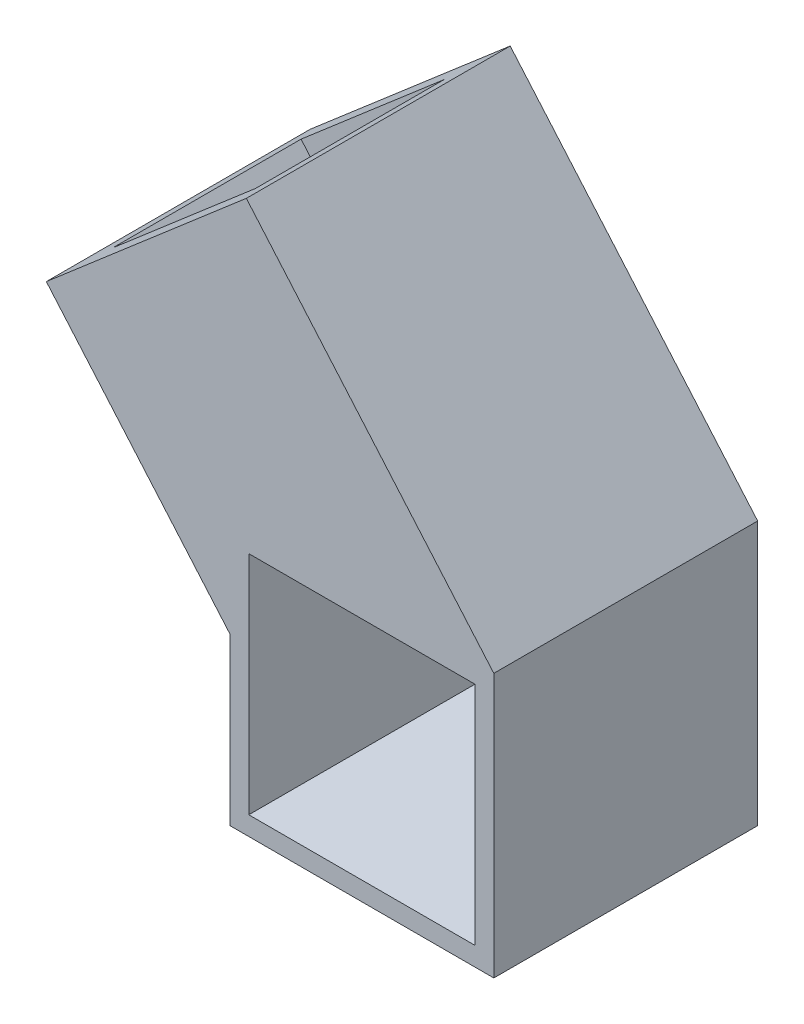
ISO-10303-21;
HEADER;
FILE_DESCRIPTION(('STEP AP214'),'2;1');
FILE_NAME('part.step','',(''),(''),'','','');
FILE_SCHEMA(('AUTOMOTIVE_DESIGN { 1 0 10303 214 1 1 1 1 }'));
ENDSEC;
DATA;
#1=APPLICATION_CONTEXT('core data for automotive mechanical design processes');
#2=APPLICATION_PROTOCOL_DEFINITION('international standard','automotive_design',2000,#1);
#3=PRODUCT_CONTEXT('',#1,'mechanical');
#4=PRODUCT('Part','Part','',(#3));
#5=PRODUCT_RELATED_PRODUCT_CATEGORY('part','',(#4));
#6=PRODUCT_DEFINITION_FORMATION('','',#4);
#7=PRODUCT_DEFINITION_CONTEXT('part definition',#1,'design');
#8=PRODUCT_DEFINITION('design','',#6,#7);
#9=PRODUCT_DEFINITION_SHAPE('','',#8);
#10=(LENGTH_UNIT() NAMED_UNIT(*) SI_UNIT(.MILLI.,.METRE.));
#11=(NAMED_UNIT(*) PLANE_ANGLE_UNIT() SI_UNIT($,.RADIAN.));
#12=(NAMED_UNIT(*) SI_UNIT($,.STERADIAN.) SOLID_ANGLE_UNIT());
#13=UNCERTAINTY_MEASURE_WITH_UNIT(LENGTH_MEASURE(1.E-05),#10,'distance_accuracy_value','');
#14=(GEOMETRIC_REPRESENTATION_CONTEXT(3) GLOBAL_UNCERTAINTY_ASSIGNED_CONTEXT((#13)) GLOBAL_UNIT_ASSIGNED_CONTEXT((#10,
#11,#12)) REPRESENTATION_CONTEXT('',''));
#15=CARTESIAN_POINT('',(0.,0.,0.));
#16=DIRECTION('',(0.,0.,1.));
#17=DIRECTION('',(1.,0.,0.));
#18=AXIS2_PLACEMENT_3D('',#15,#16,#17);
#19=CARTESIAN_POINT('',(-14.0963511863711,16.3822471357785,14.));
#20=DIRECTION('',(-0.652241888058342,0.75801089666448,0.));
#21=DIRECTION('',(-0.75801089666448,-0.652241888058342,0.));
#22=AXIS2_PLACEMENT_3D('',#19,#20,#21);
#23=PLANE('',#22);
#24=DIRECTION('',(0.75801089666448,0.652241888058342,0.));
#25=VECTOR('',#24,1.);
#26=CARTESIAN_POINT('',(-14.0963511863711,16.3822471357785,0.));
#27=LINE('',#26,#25);
#28=CARTESIAN_POINT('',(-9.74268618755543,20.1284237294086,0.));
#29=VERTEX_POINT('',#28);
#30=CARTESIAN_POINT('',(0.869466018358234,29.2598098633093,0.));
#31=VERTEX_POINT('',#30);
#32=EDGE_CURVE('E186',#29,#31,#27,.T.);
#33=ORIENTED_EDGE('',*,*,#32,.F.);
#34=DIRECTION('',(0.,0.,-1.));
#35=VECTOR('',#34,1.);
#36=CARTESIAN_POINT('',(-9.74268618755543,20.1284237294086,14.));
#37=LINE('',#36,#35);
#38=CARTESIAN_POINT('',(-9.74268618755543,20.1284237294086,14.));
#39=VERTEX_POINT('',#38);
#40=EDGE_CURVE('E216',#39,#29,#37,.T.);
#41=ORIENTED_EDGE('',*,*,#40,.F.);
#42=DIRECTION('',(0.75801089666448,0.652241888058342,0.));
#43=VECTOR('',#42,1.);
#44=CARTESIAN_POINT('',(-14.0963511863711,16.3822471357785,14.));
#45=LINE('',#44,#43);
#46=CARTESIAN_POINT('',(0.869466018358234,29.2598098633093,14.));
#47=VERTEX_POINT('',#46);
#48=EDGE_CURVE('E192',#39,#47,#45,.T.);
#49=ORIENTED_EDGE('',*,*,#48,.T.);
#50=DIRECTION('',(0.,0.,-1.));
#51=VECTOR('',#50,1.);
#52=CARTESIAN_POINT('',(0.869466018358234,29.2598098633093,14.));
#53=LINE('',#52,#51);
#54=EDGE_CURVE('E205',#47,#31,#53,.T.);
#55=ORIENTED_EDGE('',*,*,#54,.T.);
#56=EDGE_LOOP('',(#33,#41,#49,#55));
#57=FACE_BOUND('',#56,.T.);
#58=DIRECTION('',(-0.75801089666448,-0.652241888058342,0.));
#59=VECTOR('',#58,1.);
#60=CARTESIAN_POINT('',(-14.0963511863711,16.3822471357785,12.));
#61=LINE('',#60,#59);
#62=CARTESIAN_POINT('',(-0.646555427581676,27.9553263861087,12.));
#63=VERTEX_POINT('',#62);
#64=CARTESIAN_POINT('',(-8.22666439422648,21.4329075055253,12.));
#65=VERTEX_POINT('',#64);
#66=EDGE_CURVE('E177',#63,#65,#61,.T.);
#67=ORIENTED_EDGE('',*,*,#66,.T.);
#68=DIRECTION('',(0.,0.,-1.));
#69=VECTOR('',#68,1.);
#70=CARTESIAN_POINT('',(-8.22666439422648,21.4329075055253,0.));
#71=LINE('',#70,#69);
#72=CARTESIAN_POINT('',(-8.22666439422648,21.4329075055253,2.));
#73=VERTEX_POINT('',#72);
#74=EDGE_CURVE('E55',#65,#73,#71,.T.);
#75=ORIENTED_EDGE('',*,*,#74,.T.);
#76=DIRECTION('',(0.75801089666448,0.652241888058342,0.));
#77=VECTOR('',#76,1.);
#78=CARTESIAN_POINT('',(-14.0963511863711,16.3822471357785,2.));
#79=LINE('',#78,#77);
#80=CARTESIAN_POINT('',(-0.646555427581677,27.9553263861087,2.));
#81=VERTEX_POINT('',#80);
#82=EDGE_CURVE('E164',#73,#81,#79,.T.);
#83=ORIENTED_EDGE('',*,*,#82,.T.);
#84=DIRECTION('',(0.,0.,1.));
#85=VECTOR('',#84,1.);
#86=CARTESIAN_POINT('',(-0.646555427581677,27.9553263861087,0.));
#87=LINE('',#86,#85);
#88=EDGE_CURVE('E168',#81,#63,#87,.T.);
#89=ORIENTED_EDGE('',*,*,#88,.T.);
#90=EDGE_LOOP('',(#67,#75,#83,#89));
#91=FACE_BOUND('',#90,.T.);
#92=ADVANCED_FACE('F39',(#57,#91),#23,.T.);
#93=CARTESIAN_POINT('',(0.,0.,14.));
#94=DIRECTION('',(0.,0.,-1.));
#95=DIRECTION('',(-1.,0.,0.));
#96=AXIS2_PLACEMENT_3D('',#93,#94,#95);
#97=PLANE('',#96);
#98=DIRECTION('',(-0.652241888058342,0.75801089666448,0.));
#99=VECTOR('',#98,1.);
#100=CARTESIAN_POINT('',(4.35366499881566,3.74617659363011,14.));
#101=LINE('',#100,#99);
#102=CARTESIAN_POINT('',(0.,8.805841681,14.));
#103=VERTEX_POINT('',#102);
#104=EDGE_CURVE('E201',#103,#39,#101,.T.);
#105=ORIENTED_EDGE('',*,*,#104,.F.);
#106=DIRECTION('',(0.,-1.,0.));
#107=VECTOR('',#106,1.);
#108=CARTESIAN_POINT('',(0.,0.,14.));
#109=LINE('',#108,#107);
#110=CARTESIAN_POINT('',(0.,0.,14.));
#111=VERTEX_POINT('',#110);
#112=EDGE_CURVE('E63',#103,#111,#109,.T.);
#113=ORIENTED_EDGE('',*,*,#112,.T.);
#114=DIRECTION('',(1.,0.,0.));
#115=VECTOR('',#114,1.);
#116=CARTESIAN_POINT('',(0.,0.,14.));
#117=LINE('',#116,#115);
#118=CARTESIAN_POINT('',(14.,0.,14.));
#119=VERTEX_POINT('',#118);
#120=EDGE_CURVE('E270',#111,#119,#117,.T.);
#121=ORIENTED_EDGE('',*,*,#120,.T.);
#122=DIRECTION('',(0.,1.,0.));
#123=VECTOR('',#122,1.);
#124=CARTESIAN_POINT('',(14.,0.,14.));
#125=LINE('',#124,#123);
#126=CARTESIAN_POINT('',(14.,14.,14.));
#127=VERTEX_POINT('',#126);
#128=EDGE_CURVE('E274',#119,#127,#125,.T.);
#129=ORIENTED_EDGE('',*,*,#128,.T.);
#130=DIRECTION('',(0.652241888058342,-0.75801089666448,0.));
#131=VECTOR('',#130,1.);
#132=CARTESIAN_POINT('',(14.9658172047293,12.8775627275308,14.));
#133=LINE('',#132,#131);
#134=EDGE_CURVE('E196',#47,#127,#133,.T.);
#135=ORIENTED_EDGE('',*,*,#134,.F.);
#136=ORIENTED_EDGE('',*,*,#48,.F.);
#137=EDGE_LOOP('',(#105,#113,#121,#129,#135,#136));
#138=FACE_BOUND('',#137,.T.);
#139=DIRECTION('',(0.,-1.,0.));
#140=VECTOR('',#139,1.);
#141=CARTESIAN_POINT('',(1.,1.,14.));
#142=LINE('',#141,#140);
#143=CARTESIAN_POINT('',(1.,13.,14.));
#144=VERTEX_POINT('',#143);
#145=CARTESIAN_POINT('',(1.,1.,14.));
#146=VERTEX_POINT('',#145);
#147=EDGE_CURVE('E225',#144,#146,#142,.T.);
#148=ORIENTED_EDGE('',*,*,#147,.F.);
#149=DIRECTION('',(-1.,0.,0.));
#150=VECTOR('',#149,1.);
#151=CARTESIAN_POINT('',(1.,13.,14.));
#152=LINE('',#151,#150);
#153=CARTESIAN_POINT('',(13.,13.,14.));
#154=VERTEX_POINT('',#153);
#155=EDGE_CURVE('E236',#154,#144,#152,.T.);
#156=ORIENTED_EDGE('',*,*,#155,.F.);
#157=DIRECTION('',(0.,1.,0.));
#158=VECTOR('',#157,1.);
#159=CARTESIAN_POINT('',(13.,1.,14.));
#160=LINE('',#159,#158);
#161=CARTESIAN_POINT('',(13.,1.,14.));
#162=VERTEX_POINT('',#161);
#163=EDGE_CURVE('E232',#162,#154,#160,.T.);
#164=ORIENTED_EDGE('',*,*,#163,.F.);
#165=DIRECTION('',(1.,0.,0.));
#166=VECTOR('',#165,1.);
#167=CARTESIAN_POINT('',(1.,1.,14.));
#168=LINE('',#167,#166);
#169=EDGE_CURVE('E228',#146,#162,#168,.T.);
#170=ORIENTED_EDGE('',*,*,#169,.F.);
#171=EDGE_LOOP('',(#148,#156,#164,#170));
#172=FACE_BOUND('',#171,.T.);
#173=ADVANCED_FACE('F310',(#138,#172),#97,.F.);
#174=CARTESIAN_POINT('',(0.,0.,0.));
#175=DIRECTION('',(0.,0.,-1.));
#176=DIRECTION('',(-1.,0.,0.));
#177=AXIS2_PLACEMENT_3D('',#174,#175,#176);
#178=PLANE('',#177);
#179=DIRECTION('',(0.,-1.,0.));
#180=VECTOR('',#179,1.);
#181=CARTESIAN_POINT('',(0.,0.,0.));
#182=LINE('',#181,#180);
#183=CARTESIAN_POINT('',(0.,8.805841681,0.));
#184=VERTEX_POINT('',#183);
#185=CARTESIAN_POINT('',(0.,0.,0.));
#186=VERTEX_POINT('',#185);
#187=EDGE_CURVE('E267',#184,#186,#182,.T.);
#188=ORIENTED_EDGE('',*,*,#187,.F.);
#189=DIRECTION('',(-0.652241888058342,0.75801089666448,0.));
#190=VECTOR('',#189,1.);
#191=CARTESIAN_POINT('',(4.35366499881566,3.74617659363011,0.));
#192=LINE('',#191,#190);
#193=EDGE_CURVE('E197',#184,#29,#192,.T.);
#194=ORIENTED_EDGE('',*,*,#193,.T.);
#195=ORIENTED_EDGE('',*,*,#32,.T.);
#196=DIRECTION('',(0.652241888058342,-0.75801089666448,0.));
#197=VECTOR('',#196,1.);
#198=CARTESIAN_POINT('',(14.9658172047293,12.8775627275308,0.));
#199=LINE('',#198,#197);
#200=CARTESIAN_POINT('',(14.,14.,0.));
#201=VERTEX_POINT('',#200);
#202=EDGE_CURVE('E209',#31,#201,#199,.T.);
#203=ORIENTED_EDGE('',*,*,#202,.T.);
#204=DIRECTION('',(0.,1.,0.));
#205=VECTOR('',#204,1.);
#206=CARTESIAN_POINT('',(14.,0.,0.));
#207=LINE('',#206,#205);
#208=CARTESIAN_POINT('',(14.,0.,0.));
#209=VERTEX_POINT('',#208);
#210=EDGE_CURVE('E271',#209,#201,#207,.T.);
#211=ORIENTED_EDGE('',*,*,#210,.F.);
#212=DIRECTION('',(1.,0.,0.));
#213=VECTOR('',#212,1.);
#214=CARTESIAN_POINT('',(0.,0.,0.));
#215=LINE('',#214,#213);
#216=EDGE_CURVE('E280',#186,#209,#215,.T.);
#217=ORIENTED_EDGE('',*,*,#216,.F.);
#218=EDGE_LOOP('',(#188,#194,#195,#203,#211,#217));
#219=FACE_BOUND('',#218,.T.);
#220=DIRECTION('',(-1.,0.,0.));
#221=VECTOR('',#220,1.);
#222=CARTESIAN_POINT('',(1.,13.,0.));
#223=LINE('',#222,#221);
#224=CARTESIAN_POINT('',(13.,13.,0.));
#225=VERTEX_POINT('',#224);
#226=CARTESIAN_POINT('',(1.,13.,0.));
#227=VERTEX_POINT('',#226);
#228=EDGE_CURVE('E229',#225,#227,#223,.T.);
#229=ORIENTED_EDGE('',*,*,#228,.T.);
#230=DIRECTION('',(0.,-1.,0.));
#231=VECTOR('',#230,1.);
#232=CARTESIAN_POINT('',(1.,1.,0.));
#233=LINE('',#232,#231);
#234=CARTESIAN_POINT('',(1.,1.,0.));
#235=VERTEX_POINT('',#234);
#236=EDGE_CURVE('E219',#227,#235,#233,.T.);
#237=ORIENTED_EDGE('',*,*,#236,.T.);
#238=DIRECTION('',(1.,0.,0.));
#239=VECTOR('',#238,1.);
#240=CARTESIAN_POINT('',(1.,1.,0.));
#241=LINE('',#240,#239);
#242=CARTESIAN_POINT('',(13.,1.,0.));
#243=VERTEX_POINT('',#242);
#244=EDGE_CURVE('E243',#235,#243,#241,.T.);
#245=ORIENTED_EDGE('',*,*,#244,.T.);
#246=DIRECTION('',(0.,1.,0.));
#247=VECTOR('',#246,1.);
#248=CARTESIAN_POINT('',(13.,1.,0.));
#249=LINE('',#248,#247);
#250=EDGE_CURVE('E247',#243,#225,#249,.T.);
#251=ORIENTED_EDGE('',*,*,#250,.T.);
#252=EDGE_LOOP('',(#229,#237,#245,#251));
#253=FACE_BOUND('',#252,.T.);
#254=ADVANCED_FACE('F300',(#219,#253),#178,.T.);
#255=CARTESIAN_POINT('',(0.,0.,14.));
#256=DIRECTION('',(1.,0.,0.));
#257=DIRECTION('',(0.,0.,-1.));
#258=AXIS2_PLACEMENT_3D('',#255,#256,#257);
#259=PLANE('',#258);
#260=ORIENTED_EDGE('',*,*,#112,.F.);
#261=DIRECTION('',(0.,0.,-1.));
#262=VECTOR('',#261,1.);
#263=CARTESIAN_POINT('',(0.,8.805841681,14.));
#264=LINE('',#263,#262);
#265=EDGE_CURVE('E220',#103,#184,#264,.T.);
#266=ORIENTED_EDGE('',*,*,#265,.T.);
#267=ORIENTED_EDGE('',*,*,#187,.T.);
#268=DIRECTION('',(0.,0.,-1.));
#269=VECTOR('',#268,1.);
#270=CARTESIAN_POINT('',(0.,0.,14.));
#271=LINE('',#270,#269);
#272=EDGE_CURVE('E11',#111,#186,#271,.T.);
#273=ORIENTED_EDGE('',*,*,#272,.F.);
#274=EDGE_LOOP('',(#260,#266,#267,#273));
#275=FACE_BOUND('',#274,.T.);
#276=ADVANCED_FACE('F41',(#275),#259,.F.);
#277=CARTESIAN_POINT('',(0.,0.,14.));
#278=DIRECTION('',(0.,1.,0.));
#279=DIRECTION('',(0.,0.,1.));
#280=AXIS2_PLACEMENT_3D('',#277,#278,#279);
#281=PLANE('',#280);
#282=ORIENTED_EDGE('',*,*,#216,.T.);
#283=DIRECTION('',(0.,0.,-1.));
#284=VECTOR('',#283,1.);
#285=CARTESIAN_POINT('',(14.,0.,14.));
#286=LINE('',#285,#284);
#287=EDGE_CURVE('E48',#119,#209,#286,.T.);
#288=ORIENTED_EDGE('',*,*,#287,.F.);
#289=ORIENTED_EDGE('',*,*,#120,.F.);
#290=ORIENTED_EDGE('',*,*,#272,.T.);
#291=EDGE_LOOP('',(#282,#288,#289,#290));
#292=FACE_BOUND('',#291,.T.);
#293=ADVANCED_FACE('F317',(#292),#281,.F.);
#294=CARTESIAN_POINT('',(14.,0.,14.));
#295=DIRECTION('',(-1.,0.,0.));
#296=DIRECTION('',(0.,0.,1.));
#297=AXIS2_PLACEMENT_3D('',#294,#295,#296);
#298=PLANE('',#297);
#299=ORIENTED_EDGE('',*,*,#210,.T.);
#300=DIRECTION('',(0.,0.,-1.));
#301=VECTOR('',#300,1.);
#302=CARTESIAN_POINT('',(14.,14.,14.));
#303=LINE('',#302,#301);
#304=EDGE_CURVE('E277',#127,#201,#303,.T.);
#305=ORIENTED_EDGE('',*,*,#304,.F.);
#306=ORIENTED_EDGE('',*,*,#128,.F.);
#307=ORIENTED_EDGE('',*,*,#287,.T.);
#308=EDGE_LOOP('',(#299,#305,#306,#307));
#309=FACE_BOUND('',#308,.T.);
#310=ADVANCED_FACE('F293',(#309),#298,.F.);
#311=CARTESIAN_POINT('',(1.,1.,14.));
#312=DIRECTION('',(1.,0.,0.));
#313=DIRECTION('',(0.,0.,-1.));
#314=AXIS2_PLACEMENT_3D('',#311,#312,#313);
#315=PLANE('',#314);
#316=ORIENTED_EDGE('',*,*,#236,.F.);
#317=DIRECTION('',(0.,0.,-1.));
#318=VECTOR('',#317,1.);
#319=CARTESIAN_POINT('',(1.,13.,14.));
#320=LINE('',#319,#318);
#321=EDGE_CURVE('E239',#144,#227,#320,.T.);
#322=ORIENTED_EDGE('',*,*,#321,.F.);
#323=ORIENTED_EDGE('',*,*,#147,.T.);
#324=DIRECTION('',(0.,0.,-1.));
#325=VECTOR('',#324,1.);
#326=CARTESIAN_POINT('',(1.,1.,14.));
#327=LINE('',#326,#325);
#328=EDGE_CURVE('E263',#146,#235,#327,.T.);
#329=ORIENTED_EDGE('',*,*,#328,.T.);
#330=EDGE_LOOP('',(#316,#322,#323,#329));
#331=FACE_BOUND('',#330,.T.);
#332=ADVANCED_FACE('F344',(#331),#315,.T.);
#333=CARTESIAN_POINT('',(1.,1.,14.));
#334=DIRECTION('',(0.,1.,0.));
#335=DIRECTION('',(0.,0.,1.));
#336=AXIS2_PLACEMENT_3D('',#333,#334,#335);
#337=PLANE('',#336);
#338=ORIENTED_EDGE('',*,*,#244,.F.);
#339=ORIENTED_EDGE('',*,*,#328,.F.);
#340=ORIENTED_EDGE('',*,*,#169,.T.);
#341=DIRECTION('',(0.,0.,-1.));
#342=VECTOR('',#341,1.);
#343=CARTESIAN_POINT('',(13.,1.,14.));
#344=LINE('',#343,#342);
#345=EDGE_CURVE('E260',#162,#243,#344,.T.);
#346=ORIENTED_EDGE('',*,*,#345,.T.);
#347=EDGE_LOOP('',(#338,#339,#340,#346));
#348=FACE_BOUND('',#347,.T.);
#349=ADVANCED_FACE('F340',(#348),#337,.T.);
#350=CARTESIAN_POINT('',(13.,1.,14.));
#351=DIRECTION('',(-1.,0.,0.));
#352=DIRECTION('',(0.,-1.,0.));
#353=AXIS2_PLACEMENT_3D('',#350,#351,#352);
#354=PLANE('',#353);
#355=ORIENTED_EDGE('',*,*,#250,.F.);
#356=ORIENTED_EDGE('',*,*,#345,.F.);
#357=ORIENTED_EDGE('',*,*,#163,.T.);
#358=DIRECTION('',(0.,0.,-1.));
#359=VECTOR('',#358,1.);
#360=CARTESIAN_POINT('',(13.,13.,14.));
#361=LINE('',#360,#359);
#362=EDGE_CURVE('E257',#154,#225,#361,.T.);
#363=ORIENTED_EDGE('',*,*,#362,.T.);
#364=EDGE_LOOP('',(#355,#356,#357,#363));
#365=FACE_BOUND('',#364,.T.);
#366=ADVANCED_FACE('F336',(#365),#354,.T.);
#367=CARTESIAN_POINT('',(1.,13.,14.));
#368=DIRECTION('',(0.,-1.,0.));
#369=DIRECTION('',(0.,0.,-1.));
#370=AXIS2_PLACEMENT_3D('',#367,#368,#369);
#371=PLANE('',#370);
#372=ORIENTED_EDGE('',*,*,#228,.F.);
#373=ORIENTED_EDGE('',*,*,#362,.F.);
#374=ORIENTED_EDGE('',*,*,#155,.T.);
#375=ORIENTED_EDGE('',*,*,#321,.T.);
#376=EDGE_LOOP('',(#372,#373,#374,#375));
#377=FACE_BOUND('',#376,.T.);
#378=ADVANCED_FACE('F333',(#377),#371,.T.);
#379=CARTESIAN_POINT('',(4.35366499881566,3.74617659363011,14.));
#380=DIRECTION('',(-0.75801089666448,-0.652241888058342,0.));
#381=DIRECTION('',(0.652241888058342,-0.75801089666448,0.));
#382=AXIS2_PLACEMENT_3D('',#379,#380,#381);
#383=PLANE('',#382);
#384=ORIENTED_EDGE('',*,*,#193,.F.);
#385=ORIENTED_EDGE('',*,*,#265,.F.);
#386=ORIENTED_EDGE('',*,*,#104,.T.);
#387=ORIENTED_EDGE('',*,*,#40,.T.);
#388=EDGE_LOOP('',(#384,#385,#386,#387));
#389=FACE_BOUND('',#388,.T.);
#390=ADVANCED_FACE('F316',(#389),#383,.T.);
#391=CARTESIAN_POINT('',(14.9658172047293,12.8775627275308,14.));
#392=DIRECTION('',(0.75801089666448,0.652241888058342,0.));
#393=DIRECTION('',(-0.652241888058342,0.75801089666448,0.));
#394=AXIS2_PLACEMENT_3D('',#391,#392,#393);
#395=PLANE('',#394);
#396=ORIENTED_EDGE('',*,*,#202,.F.);
#397=ORIENTED_EDGE('',*,*,#54,.F.);
#398=ORIENTED_EDGE('',*,*,#134,.T.);
#399=ORIENTED_EDGE('',*,*,#304,.T.);
#400=EDGE_LOOP('',(#396,#397,#398,#399));
#401=FACE_BOUND('',#400,.T.);
#402=ADVANCED_FACE('F305',(#401),#395,.T.);
#403=CARTESIAN_POINT('',(-1.70424551364305,13.8527985388805,0.));
#404=DIRECTION('',(0.75801089666448,0.652241888058342,0.));
#405=DIRECTION('',(-0.652241888058342,0.75801089666448,0.));
#406=AXIS2_PLACEMENT_3D('',#403,#404,#405);
#407=PLANE('',#406);
#408=ORIENTED_EDGE('',*,*,#74,.F.);
#409=DIRECTION('',(-0.652241888058342,0.75801089666448,0.));
#410=VECTOR('',#409,1.);
#411=CARTESIAN_POINT('',(-1.70424551364305,13.8527985388805,12.));
#412=LINE('',#411,#410);
#413=CARTESIAN_POINT('',(-1.70424551364305,13.8527985388805,12.));
#414=VERTEX_POINT('',#413);
#415=EDGE_CURVE('E146',#414,#65,#412,.T.);
#416=ORIENTED_EDGE('',*,*,#415,.F.);
#417=DIRECTION('',(0.,0.,-1.));
#418=VECTOR('',#417,1.);
#419=CARTESIAN_POINT('',(-1.70424551364305,13.8527985388805,0.));
#420=LINE('',#419,#418);
#421=CARTESIAN_POINT('',(-1.70424551364305,13.8527985388805,2.));
#422=VERTEX_POINT('',#421);
#423=EDGE_CURVE('E154',#414,#422,#420,.T.);
#424=ORIENTED_EDGE('',*,*,#423,.T.);
#425=DIRECTION('',(-0.652241888058342,0.75801089666448,0.));
#426=VECTOR('',#425,1.);
#427=CARTESIAN_POINT('',(-1.70424551364305,13.8527985388805,2.));
#428=LINE('',#427,#426);
#429=EDGE_CURVE('E183',#422,#73,#428,.T.);
#430=ORIENTED_EDGE('',*,*,#429,.T.);
#431=EDGE_LOOP('',(#408,#416,#424,#430));
#432=FACE_BOUND('',#431,.T.);
#433=ADVANCED_FACE('F157',(#432),#407,.T.);
#434=CARTESIAN_POINT('',(-7.57393230578767,8.80213816913373,2.));
#435=DIRECTION('',(0.,0.,1.));
#436=DIRECTION('',(1.,0.,0.));
#437=AXIS2_PLACEMENT_3D('',#434,#435,#436);
#438=PLANE('',#437);
#439=ORIENTED_EDGE('',*,*,#82,.F.);
#440=ORIENTED_EDGE('',*,*,#429,.F.);
#441=DIRECTION('',(0.75801089666448,0.652241888058342,0.));
#442=VECTOR('',#441,1.);
#443=CARTESIAN_POINT('',(-7.57393230578767,8.80213816913373,2.));
#444=LINE('',#443,#442);
#445=CARTESIAN_POINT('',(5.87586345300175,20.3752174194639,2.));
#446=VERTEX_POINT('',#445);
#447=EDGE_CURVE('E160',#422,#446,#444,.T.);
#448=ORIENTED_EDGE('',*,*,#447,.T.);
#449=DIRECTION('',(-0.652241888058342,0.75801089666448,0.));
#450=VECTOR('',#449,1.);
#451=CARTESIAN_POINT('',(5.87586345300175,20.3752174194639,2.));
#452=LINE('',#451,#450);
#453=EDGE_CURVE('E187',#446,#81,#452,.T.);
#454=ORIENTED_EDGE('',*,*,#453,.T.);
#455=EDGE_LOOP('',(#439,#440,#448,#454));
#456=FACE_BOUND('',#455,.T.);
#457=ADVANCED_FACE('F387',(#456),#438,.T.);
#458=CARTESIAN_POINT('',(5.87586345300175,20.3752174194639,0.));
#459=DIRECTION('',(-0.75801089666448,-0.652241888058342,0.));
#460=DIRECTION('',(0.652241888058342,-0.75801089666448,0.));
#461=AXIS2_PLACEMENT_3D('',#458,#459,#460);
#462=PLANE('',#461);
#463=ORIENTED_EDGE('',*,*,#88,.F.);
#464=ORIENTED_EDGE('',*,*,#453,.F.);
#465=DIRECTION('',(0.,0.,1.));
#466=VECTOR('',#465,1.);
#467=CARTESIAN_POINT('',(5.87586345300175,20.3752174194639,0.));
#468=LINE('',#467,#466);
#469=CARTESIAN_POINT('',(5.87586345300175,20.3752174194639,12.));
#470=VERTEX_POINT('',#469);
#471=EDGE_CURVE('E153',#446,#470,#468,.T.);
#472=ORIENTED_EDGE('',*,*,#471,.T.);
#473=DIRECTION('',(-0.652241888058342,0.75801089666448,0.));
#474=VECTOR('',#473,1.);
#475=CARTESIAN_POINT('',(5.87586345300175,20.3752174194639,12.));
#476=LINE('',#475,#474);
#477=EDGE_CURVE('E148',#470,#63,#476,.T.);
#478=ORIENTED_EDGE('',*,*,#477,.T.);
#479=EDGE_LOOP('',(#463,#464,#472,#478));
#480=FACE_BOUND('',#479,.T.);
#481=ADVANCED_FACE('F394',(#480),#462,.T.);
#482=CARTESIAN_POINT('',(-7.57393230578767,8.80213816913373,12.));
#483=DIRECTION('',(0.,0.,-1.));
#484=DIRECTION('',(-1.,0.,0.));
#485=AXIS2_PLACEMENT_3D('',#482,#483,#484);
#486=PLANE('',#485);
#487=ORIENTED_EDGE('',*,*,#66,.F.);
#488=ORIENTED_EDGE('',*,*,#477,.F.);
#489=DIRECTION('',(-0.75801089666448,-0.652241888058342,0.));
#490=VECTOR('',#489,1.);
#491=CARTESIAN_POINT('',(-7.57393230578767,8.80213816913373,12.));
#492=LINE('',#491,#490);
#493=EDGE_CURVE('E143',#470,#414,#492,.T.);
#494=ORIENTED_EDGE('',*,*,#493,.T.);
#495=ORIENTED_EDGE('',*,*,#415,.T.);
#496=EDGE_LOOP('',(#487,#488,#494,#495));
#497=FACE_BOUND('',#496,.T.);
#498=ADVANCED_FACE('F145',(#497),#486,.T.);
#499=CARTESIAN_POINT('',(-7.57393230578767,8.80213816913373,0.));
#500=DIRECTION('',(-0.652241888058342,0.75801089666448,0.));
#501=DIRECTION('',(-0.75801089666448,-0.652241888058342,0.));
#502=AXIS2_PLACEMENT_3D('',#499,#500,#501);
#503=PLANE('',#502);
#504=ORIENTED_EDGE('',*,*,#423,.F.);
#505=ORIENTED_EDGE('',*,*,#493,.F.);
#506=ORIENTED_EDGE('',*,*,#471,.F.);
#507=ORIENTED_EDGE('',*,*,#447,.F.);
#508=EDGE_LOOP('',(#504,#505,#506,#507));
#509=FACE_BOUND('',#508,.T.);
#510=ADVANCED_FACE('F162',(#509),#503,.T.);
#511=CLOSED_SHELL('',(#92,#173,#254,#276,#293,#310,#332,#349,#366,#378,#390,#402,#433,#457,#481,
#498,#510));
#512=MANIFOLD_SOLID_BREP('B2',#511);
#513=ADVANCED_BREP_SHAPE_REPRESENTATION('',(#18,#512),#14);
#514=SHAPE_DEFINITION_REPRESENTATION(#9,#513);
ENDSEC;
END-ISO-10303-21;
